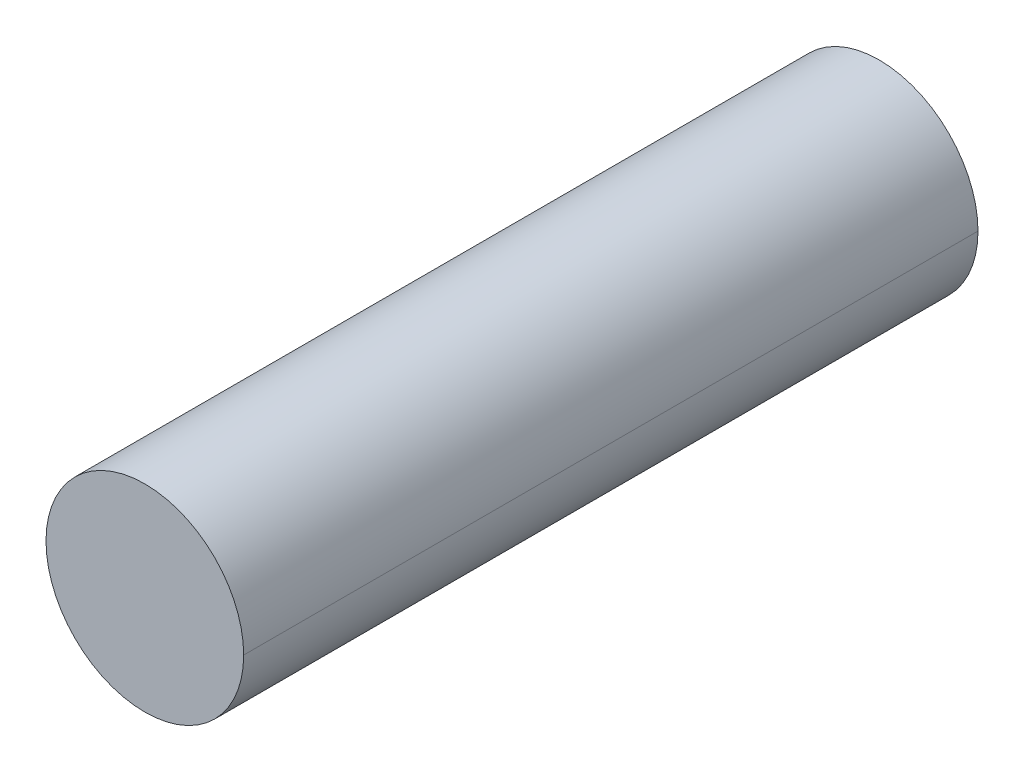
ISO-10303-21;
HEADER;
FILE_DESCRIPTION(('STEP AP214'),'2;1');
FILE_NAME('part.step','',(''),(''),'','','');
FILE_SCHEMA(('AUTOMOTIVE_DESIGN { 1 0 10303 214 1 1 1 1 }'));
ENDSEC;
DATA;
#1=APPLICATION_CONTEXT('core data for automotive mechanical design processes');
#2=APPLICATION_PROTOCOL_DEFINITION('international standard','automotive_design',2000,#1);
#3=PRODUCT_CONTEXT('',#1,'mechanical');
#4=PRODUCT('Part','Part','',(#3));
#5=PRODUCT_RELATED_PRODUCT_CATEGORY('part','',(#4));
#6=PRODUCT_DEFINITION_FORMATION('','',#4);
#7=PRODUCT_DEFINITION_CONTEXT('part definition',#1,'design');
#8=PRODUCT_DEFINITION('design','',#6,#7);
#9=PRODUCT_DEFINITION_SHAPE('','',#8);
#10=(LENGTH_UNIT() NAMED_UNIT(*) SI_UNIT(.MILLI.,.METRE.));
#11=(NAMED_UNIT(*) PLANE_ANGLE_UNIT() SI_UNIT($,.RADIAN.));
#12=(NAMED_UNIT(*) SI_UNIT($,.STERADIAN.) SOLID_ANGLE_UNIT());
#13=UNCERTAINTY_MEASURE_WITH_UNIT(LENGTH_MEASURE(1.E-05),#10,'distance_accuracy_value','');
#14=(GEOMETRIC_REPRESENTATION_CONTEXT(3) GLOBAL_UNCERTAINTY_ASSIGNED_CONTEXT((#13)) GLOBAL_UNIT_ASSIGNED_CONTEXT((#10,
#11,#12)) REPRESENTATION_CONTEXT('',''));
#15=CARTESIAN_POINT('',(0.,0.,0.));
#16=DIRECTION('',(0.,0.,1.));
#17=DIRECTION('',(1.,0.,0.));
#18=AXIS2_PLACEMENT_3D('',#15,#16,#17);
#19=CARTESIAN_POINT('',(0.,0.,0.));
#20=DIRECTION('',(0.,0.,1.));
#21=DIRECTION('',(1.,0.,0.));
#22=AXIS2_PLACEMENT_3D('',#19,#20,#21);
#23=PLANE('',#22);
#24=CARTESIAN_POINT('',(0.,0.,0.));
#25=DIRECTION('',(0.,0.,1.));
#26=DIRECTION('',(1.,0.,0.));
#27=AXIS2_PLACEMENT_3D('',#24,#25,#26);
#28=CIRCLE('',#27,3.365);
#29=CARTESIAN_POINT('',(-3.365,0.,0.));
#30=VERTEX_POINT('',#29);
#31=CARTESIAN_POINT('',(3.365,0.,0.));
#32=VERTEX_POINT('',#31);
#33=EDGE_CURVE('E11',#30,#32,#28,.T.);
#34=ORIENTED_EDGE('',*,*,#33,.F.);
#35=CARTESIAN_POINT('',(0.,0.,0.));
#36=DIRECTION('',(0.,0.,1.));
#37=DIRECTION('',(1.,0.,0.));
#38=AXIS2_PLACEMENT_3D('',#35,#36,#37);
#39=CIRCLE('',#38,3.365);
#40=EDGE_CURVE('E65',#32,#30,#39,.T.);
#41=ORIENTED_EDGE('',*,*,#40,.F.);
#42=EDGE_LOOP('',(#34,#41));
#43=FACE_BOUND('',#42,.T.);
#44=ADVANCED_FACE('F16',(#43),#23,.F.);
#45=CARTESIAN_POINT('',(0.,0.,25.));
#46=DIRECTION('',(0.,0.,1.));
#47=DIRECTION('',(1.,0.,0.));
#48=AXIS2_PLACEMENT_3D('',#45,#46,#47);
#49=PLANE('',#48);
#50=CARTESIAN_POINT('',(0.,0.,25.));
#51=DIRECTION('',(0.,0.,1.));
#52=DIRECTION('',(1.,0.,0.));
#53=AXIS2_PLACEMENT_3D('',#50,#51,#52);
#54=CIRCLE('',#53,3.365);
#55=CARTESIAN_POINT('',(-3.365,0.,25.));
#56=VERTEX_POINT('',#55);
#57=CARTESIAN_POINT('',(3.365,0.,25.));
#58=VERTEX_POINT('',#57);
#59=EDGE_CURVE('E20',#56,#58,#54,.T.);
#60=ORIENTED_EDGE('',*,*,#59,.T.);
#61=CARTESIAN_POINT('',(0.,0.,25.));
#62=DIRECTION('',(0.,0.,1.));
#63=DIRECTION('',(1.,0.,0.));
#64=AXIS2_PLACEMENT_3D('',#61,#62,#63);
#65=CIRCLE('',#64,3.365);
#66=EDGE_CURVE('E57',#58,#56,#65,.T.);
#67=ORIENTED_EDGE('',*,*,#66,.T.);
#68=EDGE_LOOP('',(#60,#67));
#69=FACE_BOUND('',#68,.T.);
#70=ADVANCED_FACE('F55',(#69),#49,.T.);
#71=CARTESIAN_POINT('',(0.,0.,25.));
#72=DIRECTION('',(0.,0.,-1.));
#73=DIRECTION('',(-1.,0.,0.));
#74=AXIS2_PLACEMENT_3D('',#71,#72,#73);
#75=CYLINDRICAL_SURFACE('',#74,3.365);
#76=DIRECTION('',(0.,0.,-1.));
#77=VECTOR('',#76,1.);
#78=CARTESIAN_POINT('',(3.365,0.,25.));
#79=LINE('',#78,#77);
#80=EDGE_CURVE('E61',#58,#32,#79,.T.);
#81=ORIENTED_EDGE('',*,*,#80,.F.);
#82=ORIENTED_EDGE('',*,*,#59,.F.);
#83=DIRECTION('',(0.,0.,-1.));
#84=VECTOR('',#83,1.);
#85=CARTESIAN_POINT('',(-3.365,0.,25.));
#86=LINE('',#85,#84);
#87=EDGE_CURVE('E59',#56,#30,#86,.T.);
#88=ORIENTED_EDGE('',*,*,#87,.T.);
#89=ORIENTED_EDGE('',*,*,#33,.T.);
#90=EDGE_LOOP('',(#81,#82,#88,#89));
#91=FACE_BOUND('',#90,.T.);
#92=ADVANCED_FACE('F18',(#91),#75,.T.);
#93=CARTESIAN_POINT('',(0.,0.,25.));
#94=DIRECTION('',(0.,0.,-1.));
#95=DIRECTION('',(-1.,0.,0.));
#96=AXIS2_PLACEMENT_3D('',#93,#94,#95);
#97=CYLINDRICAL_SURFACE('',#96,3.365);
#98=ORIENTED_EDGE('',*,*,#66,.F.);
#99=ORIENTED_EDGE('',*,*,#80,.T.);
#100=ORIENTED_EDGE('',*,*,#40,.T.);
#101=ORIENTED_EDGE('',*,*,#87,.F.);
#102=EDGE_LOOP('',(#98,#99,#100,#101));
#103=FACE_BOUND('',#102,.T.);
#104=ADVANCED_FACE('F67',(#103),#97,.T.);
#105=CLOSED_SHELL('',(#44,#70,#92,#104));
#106=MANIFOLD_SOLID_BREP('B1',#105);
#107=ADVANCED_BREP_SHAPE_REPRESENTATION('',(#18,#106),#14);
#108=SHAPE_DEFINITION_REPRESENTATION(#9,#107);
ENDSEC;
END-ISO-10303-21;
